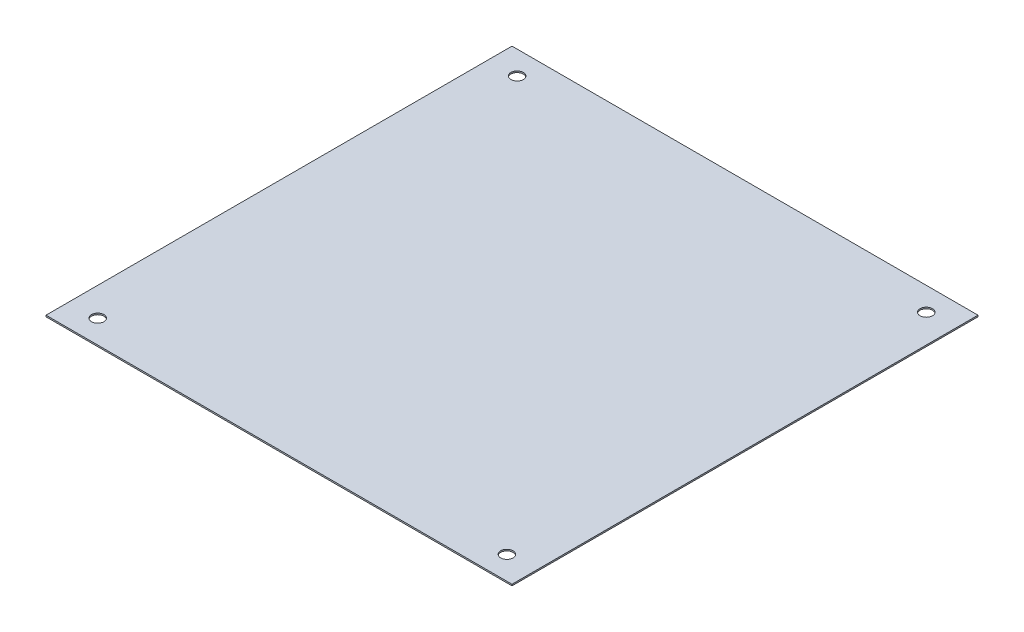
ISO-10303-21;
HEADER;
FILE_DESCRIPTION(('STEP AP214'),'2;1');
FILE_NAME('part.step','',(''),(''),'','','');
FILE_SCHEMA(('AUTOMOTIVE_DESIGN { 1 0 10303 214 1 1 1 1 }'));
ENDSEC;
DATA;
#1=APPLICATION_CONTEXT('core data for automotive mechanical design processes');
#2=APPLICATION_PROTOCOL_DEFINITION('international standard','automotive_design',2000,#1);
#3=PRODUCT_CONTEXT('',#1,'mechanical');
#4=PRODUCT('Part','Part','',(#3));
#5=PRODUCT_RELATED_PRODUCT_CATEGORY('part','',(#4));
#6=PRODUCT_DEFINITION_FORMATION('','',#4);
#7=PRODUCT_DEFINITION_CONTEXT('part definition',#1,'design');
#8=PRODUCT_DEFINITION('design','',#6,#7);
#9=PRODUCT_DEFINITION_SHAPE('','',#8);
#10=(LENGTH_UNIT() NAMED_UNIT(*) SI_UNIT(.MILLI.,.METRE.));
#11=(NAMED_UNIT(*) PLANE_ANGLE_UNIT() SI_UNIT($,.RADIAN.));
#12=(NAMED_UNIT(*) SI_UNIT($,.STERADIAN.) SOLID_ANGLE_UNIT());
#13=UNCERTAINTY_MEASURE_WITH_UNIT(LENGTH_MEASURE(1.E-05),#10,'distance_accuracy_value','');
#14=(GEOMETRIC_REPRESENTATION_CONTEXT(3) GLOBAL_UNCERTAINTY_ASSIGNED_CONTEXT((#13)) GLOBAL_UNIT_ASSIGNED_CONTEXT((#10,
#11,#12)) REPRESENTATION_CONTEXT('',''));
#15=CARTESIAN_POINT('',(0.,0.,0.));
#16=DIRECTION('',(0.,0.,1.));
#17=DIRECTION('',(1.,0.,0.));
#18=AXIS2_PLACEMENT_3D('',#15,#16,#17);
#19=CARTESIAN_POINT('',(0.,0.79375,0.));
#20=DIRECTION('',(0.,-1.,0.));
#21=DIRECTION('',(0.,0.,-1.));
#22=AXIS2_PLACEMENT_3D('',#19,#20,#21);
#23=PLANE('',#22);
#24=CARTESIAN_POINT('',(111.506,0.79375,114.3));
#25=DIRECTION('',(0.,1.,0.));
#26=DIRECTION('',(0.,0.,1.));
#27=AXIS2_PLACEMENT_3D('',#24,#25,#26);
#28=CIRCLE('',#27,3.37819999999999);
#29=CARTESIAN_POINT('',(111.506,0.79375,117.6782));
#30=VERTEX_POINT('',#29);
#31=EDGE_CURVE('E120',#30,#30,#28,.T.);
#32=ORIENTED_EDGE('',*,*,#31,.F.);
#33=EDGE_LOOP('',(#32));
#34=FACE_BOUND('',#33,.T.);
#35=CARTESIAN_POINT('',(-111.506,0.79375,-114.3));
#36=DIRECTION('',(0.,1.,0.));
#37=DIRECTION('',(0.,0.,1.));
#38=AXIS2_PLACEMENT_3D('',#35,#36,#37);
#39=CIRCLE('',#38,3.37819999999999);
#40=CARTESIAN_POINT('',(-111.506,0.79375,-110.9218));
#41=VERTEX_POINT('',#40);
#42=EDGE_CURVE('E99',#41,#41,#39,.T.);
#43=ORIENTED_EDGE('',*,*,#42,.F.);
#44=EDGE_LOOP('',(#43));
#45=FACE_BOUND('',#44,.T.);
#46=DIRECTION('',(0.,0.,-1.));
#47=VECTOR('',#46,1.);
#48=CARTESIAN_POINT('',(127.,0.79375,127.));
#49=LINE('',#48,#47);
#50=CARTESIAN_POINT('',(127.,0.79375,127.));
#51=VERTEX_POINT('',#50);
#52=CARTESIAN_POINT('',(127.,0.79375,-127.));
#53=VERTEX_POINT('',#52);
#54=EDGE_CURVE('E84',#51,#53,#49,.T.);
#55=ORIENTED_EDGE('',*,*,#54,.T.);
#56=DIRECTION('',(-1.,0.,0.));
#57=VECTOR('',#56,1.);
#58=CARTESIAN_POINT('',(-127.,0.79375,-127.));
#59=LINE('',#58,#57);
#60=CARTESIAN_POINT('',(-127.,0.79375,-127.));
#61=VERTEX_POINT('',#60);
#62=EDGE_CURVE('E79',#53,#61,#59,.T.);
#63=ORIENTED_EDGE('',*,*,#62,.T.);
#64=DIRECTION('',(0.,0.,1.));
#65=VECTOR('',#64,1.);
#66=CARTESIAN_POINT('',(-127.,0.79375,127.));
#67=LINE('',#66,#65);
#68=CARTESIAN_POINT('',(-127.,0.79375,127.));
#69=VERTEX_POINT('',#68);
#70=EDGE_CURVE('E82',#61,#69,#67,.T.);
#71=ORIENTED_EDGE('',*,*,#70,.T.);
#72=DIRECTION('',(1.,0.,0.));
#73=VECTOR('',#72,1.);
#74=CARTESIAN_POINT('',(-127.,0.79375,127.));
#75=LINE('',#74,#73);
#76=EDGE_CURVE('E49',#69,#51,#75,.T.);
#77=ORIENTED_EDGE('',*,*,#76,.T.);
#78=EDGE_LOOP('',(#55,#63,#71,#77));
#79=FACE_BOUND('',#78,.T.);
#80=CARTESIAN_POINT('',(111.506,0.79375,-114.3));
#81=DIRECTION('',(0.,1.,0.));
#82=DIRECTION('',(0.,0.,1.));
#83=AXIS2_PLACEMENT_3D('',#80,#81,#82);
#84=CIRCLE('',#83,3.37819999999999);
#85=CARTESIAN_POINT('',(111.506,0.79375,-110.9218));
#86=VERTEX_POINT('',#85);
#87=EDGE_CURVE('E114',#86,#86,#84,.T.);
#88=ORIENTED_EDGE('',*,*,#87,.F.);
#89=EDGE_LOOP('',(#88));
#90=FACE_BOUND('',#89,.T.);
#91=CARTESIAN_POINT('',(-111.506,0.79375,114.3));
#92=DIRECTION('',(0.,1.,0.));
#93=DIRECTION('',(0.,0.,1.));
#94=AXIS2_PLACEMENT_3D('',#91,#92,#93);
#95=CIRCLE('',#94,3.37819999999999);
#96=CARTESIAN_POINT('',(-111.506,0.79375,117.6782));
#97=VERTEX_POINT('',#96);
#98=EDGE_CURVE('E126',#97,#97,#95,.T.);
#99=ORIENTED_EDGE('',*,*,#98,.F.);
#100=EDGE_LOOP('',(#99));
#101=FACE_BOUND('',#100,.T.);
#102=ADVANCED_FACE('F32',(#34,#45,#79,#90,#101),#23,.F.);
#103=CARTESIAN_POINT('',(0.,0.,0.));
#104=DIRECTION('',(0.,-1.,0.));
#105=DIRECTION('',(0.,0.,-1.));
#106=AXIS2_PLACEMENT_3D('',#103,#104,#105);
#107=PLANE('',#106);
#108=CARTESIAN_POINT('',(111.506,0.,114.3));
#109=DIRECTION('',(0.,1.,0.));
#110=DIRECTION('',(0.,0.,1.));
#111=AXIS2_PLACEMENT_3D('',#108,#109,#110);
#112=CIRCLE('',#111,3.37819999999999);
#113=CARTESIAN_POINT('',(111.506,0.,117.6782));
#114=VERTEX_POINT('',#113);
#115=EDGE_CURVE('E123',#114,#114,#112,.T.);
#116=ORIENTED_EDGE('',*,*,#115,.T.);
#117=EDGE_LOOP('',(#116));
#118=FACE_BOUND('',#117,.T.);
#119=CARTESIAN_POINT('',(-111.506,0.,-114.3));
#120=DIRECTION('',(0.,1.,0.));
#121=DIRECTION('',(0.,0.,1.));
#122=AXIS2_PLACEMENT_3D('',#119,#120,#121);
#123=CIRCLE('',#122,3.37819999999999);
#124=CARTESIAN_POINT('',(-111.506,0.,-110.9218));
#125=VERTEX_POINT('',#124);
#126=EDGE_CURVE('E111',#125,#125,#123,.T.);
#127=ORIENTED_EDGE('',*,*,#126,.T.);
#128=EDGE_LOOP('',(#127));
#129=FACE_BOUND('',#128,.T.);
#130=DIRECTION('',(0.,0.,-1.));
#131=VECTOR('',#130,1.);
#132=CARTESIAN_POINT('',(127.,0.,127.));
#133=LINE('',#132,#131);
#134=CARTESIAN_POINT('',(127.,0.,127.));
#135=VERTEX_POINT('',#134);
#136=CARTESIAN_POINT('',(127.,0.,-127.));
#137=VERTEX_POINT('',#136);
#138=EDGE_CURVE('E96',#135,#137,#133,.T.);
#139=ORIENTED_EDGE('',*,*,#138,.F.);
#140=DIRECTION('',(1.,0.,0.));
#141=VECTOR('',#140,1.);
#142=CARTESIAN_POINT('',(-127.,0.,127.));
#143=LINE('',#142,#141);
#144=CARTESIAN_POINT('',(-127.,0.,127.));
#145=VERTEX_POINT('',#144);
#146=EDGE_CURVE('E72',#145,#135,#143,.T.);
#147=ORIENTED_EDGE('',*,*,#146,.F.);
#148=DIRECTION('',(0.,0.,1.));
#149=VECTOR('',#148,1.);
#150=CARTESIAN_POINT('',(-127.,0.,127.));
#151=LINE('',#150,#149);
#152=CARTESIAN_POINT('',(-127.,0.,-127.));
#153=VERTEX_POINT('',#152);
#154=EDGE_CURVE('E66',#153,#145,#151,.T.);
#155=ORIENTED_EDGE('',*,*,#154,.F.);
#156=DIRECTION('',(-1.,0.,0.));
#157=VECTOR('',#156,1.);
#158=CARTESIAN_POINT('',(-127.,0.,-127.));
#159=LINE('',#158,#157);
#160=EDGE_CURVE('E88',#137,#153,#159,.T.);
#161=ORIENTED_EDGE('',*,*,#160,.F.);
#162=EDGE_LOOP('',(#139,#147,#155,#161));
#163=FACE_BOUND('',#162,.T.);
#164=CARTESIAN_POINT('',(111.506,0.,-114.3));
#165=DIRECTION('',(0.,1.,0.));
#166=DIRECTION('',(0.,0.,1.));
#167=AXIS2_PLACEMENT_3D('',#164,#165,#166);
#168=CIRCLE('',#167,3.37819999999999);
#169=CARTESIAN_POINT('',(111.506,0.,-110.9218));
#170=VERTEX_POINT('',#169);
#171=EDGE_CURVE('E117',#170,#170,#168,.T.);
#172=ORIENTED_EDGE('',*,*,#171,.T.);
#173=EDGE_LOOP('',(#172));
#174=FACE_BOUND('',#173,.T.);
#175=CARTESIAN_POINT('',(-111.506,0.,114.3));
#176=DIRECTION('',(0.,1.,0.));
#177=DIRECTION('',(0.,0.,1.));
#178=AXIS2_PLACEMENT_3D('',#175,#176,#177);
#179=CIRCLE('',#178,3.37819999999999);
#180=CARTESIAN_POINT('',(-111.506,0.,117.6782));
#181=VERTEX_POINT('',#180);
#182=EDGE_CURVE('E129',#181,#181,#179,.T.);
#183=ORIENTED_EDGE('',*,*,#182,.T.);
#184=EDGE_LOOP('',(#183));
#185=FACE_BOUND('',#184,.T.);
#186=ADVANCED_FACE('F107',(#118,#129,#163,#174,#185),#107,.T.);
#187=CARTESIAN_POINT('',(127.,0.79375,127.));
#188=DIRECTION('',(-1.,0.,0.));
#189=DIRECTION('',(0.,0.,1.));
#190=AXIS2_PLACEMENT_3D('',#187,#188,#189);
#191=PLANE('',#190);
#192=ORIENTED_EDGE('',*,*,#138,.T.);
#193=DIRECTION('',(0.,-1.,0.));
#194=VECTOR('',#193,1.);
#195=CARTESIAN_POINT('',(127.,0.79375,-127.));
#196=LINE('',#195,#194);
#197=EDGE_CURVE('E11',#53,#137,#196,.T.);
#198=ORIENTED_EDGE('',*,*,#197,.F.);
#199=ORIENTED_EDGE('',*,*,#54,.F.);
#200=DIRECTION('',(0.,-1.,0.));
#201=VECTOR('',#200,1.);
#202=CARTESIAN_POINT('',(127.,0.79375,127.));
#203=LINE('',#202,#201);
#204=EDGE_CURVE('E92',#51,#135,#203,.T.);
#205=ORIENTED_EDGE('',*,*,#204,.T.);
#206=EDGE_LOOP('',(#192,#198,#199,#205));
#207=FACE_BOUND('',#206,.T.);
#208=ADVANCED_FACE('F34',(#207),#191,.F.);
#209=CARTESIAN_POINT('',(-127.,0.79375,-127.));
#210=DIRECTION('',(0.,0.,1.));
#211=DIRECTION('',(1.,0.,0.));
#212=AXIS2_PLACEMENT_3D('',#209,#210,#211);
#213=PLANE('',#212);
#214=ORIENTED_EDGE('',*,*,#160,.T.);
#215=DIRECTION('',(0.,-1.,0.));
#216=VECTOR('',#215,1.);
#217=CARTESIAN_POINT('',(-127.,0.79375,-127.));
#218=LINE('',#217,#216);
#219=EDGE_CURVE('E41',#61,#153,#218,.T.);
#220=ORIENTED_EDGE('',*,*,#219,.F.);
#221=ORIENTED_EDGE('',*,*,#62,.F.);
#222=ORIENTED_EDGE('',*,*,#197,.T.);
#223=EDGE_LOOP('',(#214,#220,#221,#222));
#224=FACE_BOUND('',#223,.T.);
#225=ADVANCED_FACE('F87',(#224),#213,.F.);
#226=CARTESIAN_POINT('',(-127.,0.79375,127.));
#227=DIRECTION('',(1.,0.,0.));
#228=DIRECTION('',(0.,0.,-1.));
#229=AXIS2_PLACEMENT_3D('',#226,#227,#228);
#230=PLANE('',#229);
#231=ORIENTED_EDGE('',*,*,#154,.T.);
#232=DIRECTION('',(0.,-1.,0.));
#233=VECTOR('',#232,1.);
#234=CARTESIAN_POINT('',(-127.,0.79375,127.));
#235=LINE('',#234,#233);
#236=EDGE_CURVE('E89',#69,#145,#235,.T.);
#237=ORIENTED_EDGE('',*,*,#236,.F.);
#238=ORIENTED_EDGE('',*,*,#70,.F.);
#239=ORIENTED_EDGE('',*,*,#219,.T.);
#240=EDGE_LOOP('',(#231,#237,#238,#239));
#241=FACE_BOUND('',#240,.T.);
#242=ADVANCED_FACE('F90',(#241),#230,.F.);
#243=CARTESIAN_POINT('',(-127.,0.79375,127.));
#244=DIRECTION('',(0.,0.,-1.));
#245=DIRECTION('',(-1.,0.,0.));
#246=AXIS2_PLACEMENT_3D('',#243,#244,#245);
#247=PLANE('',#246);
#248=ORIENTED_EDGE('',*,*,#146,.T.);
#249=ORIENTED_EDGE('',*,*,#204,.F.);
#250=ORIENTED_EDGE('',*,*,#76,.F.);
#251=ORIENTED_EDGE('',*,*,#236,.T.);
#252=EDGE_LOOP('',(#248,#249,#250,#251));
#253=FACE_BOUND('',#252,.T.);
#254=ADVANCED_FACE('F104',(#253),#247,.F.);
#255=CARTESIAN_POINT('',(-111.506,0.79375,-114.3));
#256=DIRECTION('',(0.,-1.,0.));
#257=DIRECTION('',(0.,0.,-1.));
#258=AXIS2_PLACEMENT_3D('',#255,#256,#257);
#259=CYLINDRICAL_SURFACE('',#258,3.37819999999999);
#260=ORIENTED_EDGE('',*,*,#42,.T.);
#261=EDGE_LOOP('',(#260));
#262=FACE_BOUND('',#261,.T.);
#263=ORIENTED_EDGE('',*,*,#126,.F.);
#264=EDGE_LOOP('',(#263));
#265=FACE_BOUND('',#264,.T.);
#266=ADVANCED_FACE('F149',(#262,#265),#259,.F.);
#267=CARTESIAN_POINT('',(111.506,0.79375,-114.3));
#268=DIRECTION('',(0.,-1.,0.));
#269=DIRECTION('',(0.,0.,-1.));
#270=AXIS2_PLACEMENT_3D('',#267,#268,#269);
#271=CYLINDRICAL_SURFACE('',#270,3.37819999999999);
#272=ORIENTED_EDGE('',*,*,#87,.T.);
#273=EDGE_LOOP('',(#272));
#274=FACE_BOUND('',#273,.T.);
#275=ORIENTED_EDGE('',*,*,#171,.F.);
#276=EDGE_LOOP('',(#275));
#277=FACE_BOUND('',#276,.T.);
#278=ADVANCED_FACE('F195',(#274,#277),#271,.F.);
#279=CARTESIAN_POINT('',(111.506,0.79375,114.3));
#280=DIRECTION('',(0.,-1.,0.));
#281=DIRECTION('',(0.,0.,-1.));
#282=AXIS2_PLACEMENT_3D('',#279,#280,#281);
#283=CYLINDRICAL_SURFACE('',#282,3.37819999999999);
#284=ORIENTED_EDGE('',*,*,#31,.T.);
#285=EDGE_LOOP('',(#284));
#286=FACE_BOUND('',#285,.T.);
#287=ORIENTED_EDGE('',*,*,#115,.F.);
#288=EDGE_LOOP('',(#287));
#289=FACE_BOUND('',#288,.T.);
#290=ADVANCED_FACE('F203',(#286,#289),#283,.F.);
#291=CARTESIAN_POINT('',(-111.506,0.79375,114.3));
#292=DIRECTION('',(0.,-1.,0.));
#293=DIRECTION('',(0.,0.,-1.));
#294=AXIS2_PLACEMENT_3D('',#291,#292,#293);
#295=CYLINDRICAL_SURFACE('',#294,3.37819999999999);
#296=ORIENTED_EDGE('',*,*,#98,.T.);
#297=EDGE_LOOP('',(#296));
#298=FACE_BOUND('',#297,.T.);
#299=ORIENTED_EDGE('',*,*,#182,.F.);
#300=EDGE_LOOP('',(#299));
#301=FACE_BOUND('',#300,.T.);
#302=ADVANCED_FACE('F135',(#298,#301),#295,.F.);
#303=CLOSED_SHELL('',(#102,#186,#208,#225,#242,#254,#266,#278,#290,#302));
#304=MANIFOLD_SOLID_BREP('B2',#303);
#305=ADVANCED_BREP_SHAPE_REPRESENTATION('',(#18,#304),#14);
#306=SHAPE_DEFINITION_REPRESENTATION(#9,#305);
ENDSEC;
END-ISO-10303-21;
